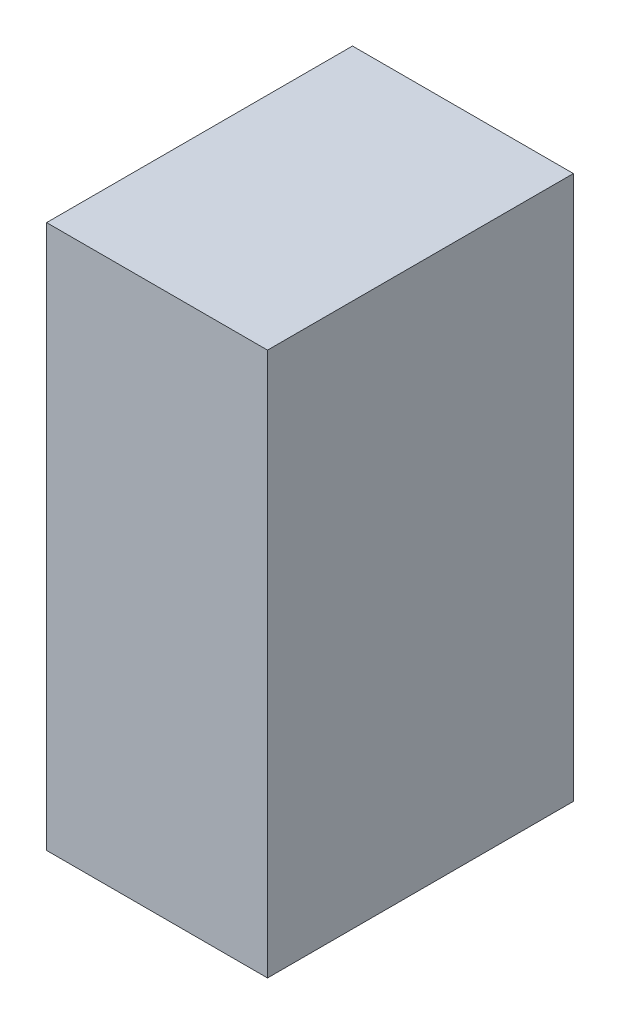
ISO-10303-21;
HEADER;
FILE_DESCRIPTION(('STEP AP214'),'2;1');
FILE_NAME('part.step','',(''),(''),'','','');
FILE_SCHEMA(('AUTOMOTIVE_DESIGN { 1 0 10303 214 1 1 1 1 }'));
ENDSEC;
DATA;
#1=APPLICATION_CONTEXT('core data for automotive mechanical design processes');
#2=APPLICATION_PROTOCOL_DEFINITION('international standard','automotive_design',2000,#1);
#3=PRODUCT_CONTEXT('',#1,'mechanical');
#4=PRODUCT('Part','Part','',(#3));
#5=PRODUCT_RELATED_PRODUCT_CATEGORY('part','',(#4));
#6=PRODUCT_DEFINITION_FORMATION('','',#4);
#7=PRODUCT_DEFINITION_CONTEXT('part definition',#1,'design');
#8=PRODUCT_DEFINITION('design','',#6,#7);
#9=PRODUCT_DEFINITION_SHAPE('','',#8);
#10=(LENGTH_UNIT() NAMED_UNIT(*) SI_UNIT(.MILLI.,.METRE.));
#11=(NAMED_UNIT(*) PLANE_ANGLE_UNIT() SI_UNIT($,.RADIAN.));
#12=(NAMED_UNIT(*) SI_UNIT($,.STERADIAN.) SOLID_ANGLE_UNIT());
#13=UNCERTAINTY_MEASURE_WITH_UNIT(LENGTH_MEASURE(1.E-05),#10,'distance_accuracy_value','');
#14=(GEOMETRIC_REPRESENTATION_CONTEXT(3) GLOBAL_UNCERTAINTY_ASSIGNED_CONTEXT((#13)) GLOBAL_UNIT_ASSIGNED_CONTEXT((#10,
#11,#12)) REPRESENTATION_CONTEXT('',''));
#15=CARTESIAN_POINT('',(0.,0.,0.));
#16=DIRECTION('',(0.,0.,1.));
#17=DIRECTION('',(1.,0.,0.));
#18=AXIS2_PLACEMENT_3D('',#15,#16,#17);
#19=CARTESIAN_POINT('',(0.,16.,0.));
#20=DIRECTION('',(1.,0.,0.));
#21=DIRECTION('',(0.,0.,-1.));
#22=AXIS2_PLACEMENT_3D('',#19,#20,#21);
#23=PLANE('',#22);
#24=DIRECTION('',(0.,0.,1.));
#25=VECTOR('',#24,1.);
#26=CARTESIAN_POINT('',(0.,0.,0.));
#27=LINE('',#26,#25);
#28=CARTESIAN_POINT('',(0.,0.,-9.));
#29=VERTEX_POINT('',#28);
#30=CARTESIAN_POINT('',(0.,0.,0.));
#31=VERTEX_POINT('',#30);
#32=EDGE_CURVE('E96',#29,#31,#27,.T.);
#33=ORIENTED_EDGE('',*,*,#32,.T.);
#34=DIRECTION('',(0.,-1.,0.));
#35=VECTOR('',#34,1.);
#36=CARTESIAN_POINT('',(0.,16.,0.));
#37=LINE('',#36,#35);
#38=CARTESIAN_POINT('',(0.,16.,0.));
#39=VERTEX_POINT('',#38);
#40=EDGE_CURVE('E11',#39,#31,#37,.T.);
#41=ORIENTED_EDGE('',*,*,#40,.F.);
#42=DIRECTION('',(0.,0.,1.));
#43=VECTOR('',#42,1.);
#44=CARTESIAN_POINT('',(0.,16.,0.));
#45=LINE('',#44,#43);
#46=CARTESIAN_POINT('',(0.,16.,-9.));
#47=VERTEX_POINT('',#46);
#48=EDGE_CURVE('E84',#47,#39,#45,.T.);
#49=ORIENTED_EDGE('',*,*,#48,.F.);
#50=DIRECTION('',(0.,-1.,0.));
#51=VECTOR('',#50,1.);
#52=CARTESIAN_POINT('',(0.,16.,-9.));
#53=LINE('',#52,#51);
#54=EDGE_CURVE('E92',#47,#29,#53,.T.);
#55=ORIENTED_EDGE('',*,*,#54,.T.);
#56=EDGE_LOOP('',(#33,#41,#49,#55));
#57=FACE_BOUND('',#56,.T.);
#58=ADVANCED_FACE('F33',(#57),#23,.F.);
#59=CARTESIAN_POINT('',(0.,16.,0.));
#60=DIRECTION('',(0.,0.,-1.));
#61=DIRECTION('',(-1.,0.,0.));
#62=AXIS2_PLACEMENT_3D('',#59,#60,#61);
#63=PLANE('',#62);
#64=DIRECTION('',(1.,0.,0.));
#65=VECTOR('',#64,1.);
#66=CARTESIAN_POINT('',(0.,0.,0.));
#67=LINE('',#66,#65);
#68=CARTESIAN_POINT('',(6.50000000000001,0.,0.));
#69=VERTEX_POINT('',#68);
#70=EDGE_CURVE('E88',#31,#69,#67,.T.);
#71=ORIENTED_EDGE('',*,*,#70,.T.);
#72=DIRECTION('',(0.,-1.,0.));
#73=VECTOR('',#72,1.);
#74=CARTESIAN_POINT('',(6.50000000000001,16.,0.));
#75=LINE('',#74,#73);
#76=CARTESIAN_POINT('',(6.50000000000001,16.,0.));
#77=VERTEX_POINT('',#76);
#78=EDGE_CURVE('E41',#77,#69,#75,.T.);
#79=ORIENTED_EDGE('',*,*,#78,.F.);
#80=DIRECTION('',(1.,0.,0.));
#81=VECTOR('',#80,1.);
#82=CARTESIAN_POINT('',(0.,16.,0.));
#83=LINE('',#82,#81);
#84=EDGE_CURVE('E79',#39,#77,#83,.T.);
#85=ORIENTED_EDGE('',*,*,#84,.F.);
#86=ORIENTED_EDGE('',*,*,#40,.T.);
#87=EDGE_LOOP('',(#71,#79,#85,#86));
#88=FACE_BOUND('',#87,.T.);
#89=ADVANCED_FACE('F87',(#88),#63,.F.);
#90=CARTESIAN_POINT('',(6.50000000000001,16.,0.));
#91=DIRECTION('',(-1.,0.,0.));
#92=DIRECTION('',(0.,0.,1.));
#93=AXIS2_PLACEMENT_3D('',#90,#91,#92);
#94=PLANE('',#93);
#95=DIRECTION('',(0.,0.,-1.));
#96=VECTOR('',#95,1.);
#97=CARTESIAN_POINT('',(6.50000000000001,0.,0.));
#98=LINE('',#97,#96);
#99=CARTESIAN_POINT('',(6.50000000000001,0.,-9.));
#100=VERTEX_POINT('',#99);
#101=EDGE_CURVE('E66',#69,#100,#98,.T.);
#102=ORIENTED_EDGE('',*,*,#101,.T.);
#103=DIRECTION('',(0.,-1.,0.));
#104=VECTOR('',#103,1.);
#105=CARTESIAN_POINT('',(6.50000000000001,16.,-9.));
#106=LINE('',#105,#104);
#107=CARTESIAN_POINT('',(6.50000000000001,16.,-9.));
#108=VERTEX_POINT('',#107);
#109=EDGE_CURVE('E89',#108,#100,#106,.T.);
#110=ORIENTED_EDGE('',*,*,#109,.F.);
#111=DIRECTION('',(0.,0.,-1.));
#112=VECTOR('',#111,1.);
#113=CARTESIAN_POINT('',(6.50000000000001,16.,0.));
#114=LINE('',#113,#112);
#115=EDGE_CURVE('E82',#77,#108,#114,.T.);
#116=ORIENTED_EDGE('',*,*,#115,.F.);
#117=ORIENTED_EDGE('',*,*,#78,.T.);
#118=EDGE_LOOP('',(#102,#110,#116,#117));
#119=FACE_BOUND('',#118,.T.);
#120=ADVANCED_FACE('F90',(#119),#94,.F.);
#121=CARTESIAN_POINT('',(0.,16.,-9.));
#122=DIRECTION('',(0.,0.,1.));
#123=DIRECTION('',(1.,0.,0.));
#124=AXIS2_PLACEMENT_3D('',#121,#122,#123);
#125=PLANE('',#124);
#126=DIRECTION('',(-1.,0.,0.));
#127=VECTOR('',#126,1.);
#128=CARTESIAN_POINT('',(0.,0.,-9.));
#129=LINE('',#128,#127);
#130=EDGE_CURVE('E72',#100,#29,#129,.T.);
#131=ORIENTED_EDGE('',*,*,#130,.T.);
#132=ORIENTED_EDGE('',*,*,#54,.F.);
#133=DIRECTION('',(-1.,0.,0.));
#134=VECTOR('',#133,1.);
#135=CARTESIAN_POINT('',(0.,16.,-9.));
#136=LINE('',#135,#134);
#137=EDGE_CURVE('E49',#108,#47,#136,.T.);
#138=ORIENTED_EDGE('',*,*,#137,.F.);
#139=ORIENTED_EDGE('',*,*,#109,.T.);
#140=EDGE_LOOP('',(#131,#132,#138,#139));
#141=FACE_BOUND('',#140,.T.);
#142=ADVANCED_FACE('F103',(#141),#125,.F.);
#143=CARTESIAN_POINT('',(0.,16.,0.));
#144=DIRECTION('',(0.,-1.,0.));
#145=DIRECTION('',(0.,0.,-1.));
#146=AXIS2_PLACEMENT_3D('',#143,#144,#145);
#147=PLANE('',#146);
#148=ORIENTED_EDGE('',*,*,#48,.T.);
#149=ORIENTED_EDGE('',*,*,#84,.T.);
#150=ORIENTED_EDGE('',*,*,#115,.T.);
#151=ORIENTED_EDGE('',*,*,#137,.T.);
#152=EDGE_LOOP('',(#148,#149,#150,#151));
#153=FACE_BOUND('',#152,.T.);
#154=ADVANCED_FACE('F80',(#153),#147,.F.);
#155=CARTESIAN_POINT('',(0.,0.,0.));
#156=DIRECTION('',(0.,-1.,0.));
#157=DIRECTION('',(0.,0.,-1.));
#158=AXIS2_PLACEMENT_3D('',#155,#156,#157);
#159=PLANE('',#158);
#160=ORIENTED_EDGE('',*,*,#32,.F.);
#161=ORIENTED_EDGE('',*,*,#130,.F.);
#162=ORIENTED_EDGE('',*,*,#101,.F.);
#163=ORIENTED_EDGE('',*,*,#70,.F.);
#164=EDGE_LOOP('',(#160,#161,#162,#163));
#165=FACE_BOUND('',#164,.T.);
#166=ADVANCED_FACE('F106',(#165),#159,.T.);
#167=CLOSED_SHELL('',(#58,#89,#120,#142,#154,#166));
#168=MANIFOLD_SOLID_BREP('B2',#167);
#169=ADVANCED_BREP_SHAPE_REPRESENTATION('',(#18,#168),#14);
#170=SHAPE_DEFINITION_REPRESENTATION(#9,#169);
ENDSEC;
END-ISO-10303-21;
